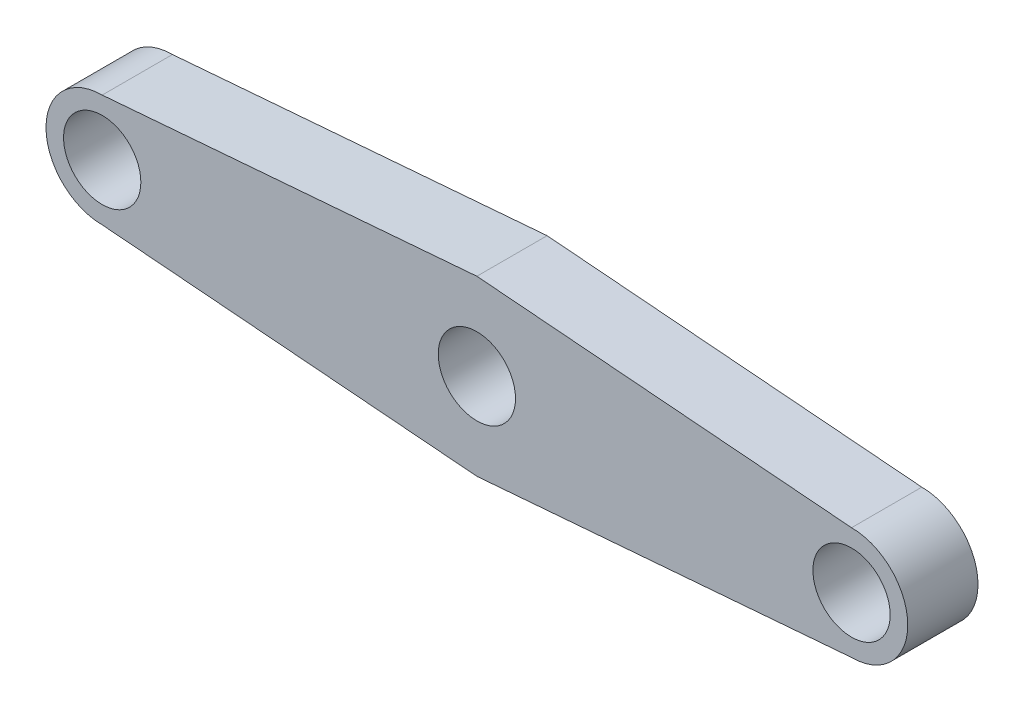
ISO-10303-21;
HEADER;
FILE_DESCRIPTION(('STEP AP214'),'2;1');
FILE_NAME('part.step','',(''),(''),'','','');
FILE_SCHEMA(('AUTOMOTIVE_DESIGN { 1 0 10303 214 1 1 1 1 }'));
ENDSEC;
DATA;
#1=APPLICATION_CONTEXT('core data for automotive mechanical design processes');
#2=APPLICATION_PROTOCOL_DEFINITION('international standard','automotive_design',2000,#1);
#3=PRODUCT_CONTEXT('',#1,'mechanical');
#4=PRODUCT('Part','Part','',(#3));
#5=PRODUCT_RELATED_PRODUCT_CATEGORY('part','',(#4));
#6=PRODUCT_DEFINITION_FORMATION('','',#4);
#7=PRODUCT_DEFINITION_CONTEXT('part definition',#1,'design');
#8=PRODUCT_DEFINITION('design','',#6,#7);
#9=PRODUCT_DEFINITION_SHAPE('','',#8);
#10=(LENGTH_UNIT() NAMED_UNIT(*) SI_UNIT(.MILLI.,.METRE.));
#11=(NAMED_UNIT(*) PLANE_ANGLE_UNIT() SI_UNIT($,.RADIAN.));
#12=(NAMED_UNIT(*) SI_UNIT($,.STERADIAN.) SOLID_ANGLE_UNIT());
#13=UNCERTAINTY_MEASURE_WITH_UNIT(LENGTH_MEASURE(1.E-05),#10,'distance_accuracy_value','');
#14=(GEOMETRIC_REPRESENTATION_CONTEXT(3) GLOBAL_UNCERTAINTY_ASSIGNED_CONTEXT((#13)) GLOBAL_UNIT_ASSIGNED_CONTEXT((#10,
#11,#12)) REPRESENTATION_CONTEXT('',''));
#15=CARTESIAN_POINT('',(0.,0.,0.));
#16=DIRECTION('',(0.,0.,1.));
#17=DIRECTION('',(1.,0.,0.));
#18=AXIS2_PLACEMENT_3D('',#15,#16,#17);
#19=CARTESIAN_POINT('',(16.,0.,3.));
#20=DIRECTION('',(0.,0.,-1.));
#21=DIRECTION('',(-1.,0.,0.));
#22=AXIS2_PLACEMENT_3D('',#19,#20,#21);
#23=CYLINDRICAL_SURFACE('',#22,1.65);
#24=CARTESIAN_POINT('',(16.,0.,3.));
#25=DIRECTION('',(0.,0.,1.));
#26=DIRECTION('',(1.,0.,0.));
#27=AXIS2_PLACEMENT_3D('',#24,#25,#26);
#28=CIRCLE('',#27,1.65);
#29=CARTESIAN_POINT('',(17.65,0.,3.));
#30=VERTEX_POINT('',#29);
#31=EDGE_CURVE('E177',#30,#30,#28,.T.);
#32=ORIENTED_EDGE('',*,*,#31,.T.);
#33=EDGE_LOOP('',(#32));
#34=FACE_BOUND('',#33,.T.);
#35=CARTESIAN_POINT('',(16.,0.,0.));
#36=DIRECTION('',(0.,0.,1.));
#37=DIRECTION('',(1.,0.,0.));
#38=AXIS2_PLACEMENT_3D('',#35,#36,#37);
#39=CIRCLE('',#38,1.65);
#40=CARTESIAN_POINT('',(17.65,0.,0.));
#41=VERTEX_POINT('',#40);
#42=EDGE_CURVE('E196',#41,#41,#39,.T.);
#43=ORIENTED_EDGE('',*,*,#42,.F.);
#44=EDGE_LOOP('',(#43));
#45=FACE_BOUND('',#44,.T.);
#46=ADVANCED_FACE('F88',(#34,#45),#23,.F.);
#47=CARTESIAN_POINT('',(0.,0.,3.));
#48=DIRECTION('',(0.,0.,-1.));
#49=DIRECTION('',(-1.,0.,0.));
#50=AXIS2_PLACEMENT_3D('',#47,#48,#49);
#51=CYLINDRICAL_SURFACE('',#50,1.65);
#52=CARTESIAN_POINT('',(0.,0.,3.));
#53=DIRECTION('',(0.,0.,1.));
#54=DIRECTION('',(1.,0.,0.));
#55=AXIS2_PLACEMENT_3D('',#52,#53,#54);
#56=CIRCLE('',#55,1.65);
#57=CARTESIAN_POINT('',(1.65,0.,3.));
#58=VERTEX_POINT('',#57);
#59=EDGE_CURVE('E174',#58,#58,#56,.T.);
#60=ORIENTED_EDGE('',*,*,#59,.T.);
#61=EDGE_LOOP('',(#60));
#62=FACE_BOUND('',#61,.T.);
#63=CARTESIAN_POINT('',(0.,0.,0.));
#64=DIRECTION('',(0.,0.,1.));
#65=DIRECTION('',(1.,0.,0.));
#66=AXIS2_PLACEMENT_3D('',#63,#64,#65);
#67=CIRCLE('',#66,1.65);
#68=CARTESIAN_POINT('',(1.65,0.,0.));
#69=VERTEX_POINT('',#68);
#70=EDGE_CURVE('E193',#69,#69,#67,.T.);
#71=ORIENTED_EDGE('',*,*,#70,.F.);
#72=EDGE_LOOP('',(#71));
#73=FACE_BOUND('',#72,.T.);
#74=ADVANCED_FACE('F230',(#62,#73),#51,.F.);
#75=CARTESIAN_POINT('',(-0.298653420776902,-3.67573440956188,3.));
#76=DIRECTION('',(0.0809831321077375,0.996715472095232,0.));
#77=DIRECTION('',(-0.996715472095232,0.0809831321077376,0.));
#78=AXIS2_PLACEMENT_3D('',#75,#76,#77);
#79=PLANE('',#78);
#80=DIRECTION('',(0.996715472095232,-0.0809831321077376,0.));
#81=VECTOR('',#80,1.);
#82=CARTESIAN_POINT('',(-0.298653420776902,-3.67573440956188,0.));
#83=LINE('',#82,#81);
#84=CARTESIAN_POINT('',(-16.,-2.4,0.));
#85=VERTEX_POINT('',#84);
#86=CARTESIAN_POINT('',(0.,-3.7,0.));
#87=VERTEX_POINT('',#86);
#88=EDGE_CURVE('E180',#85,#87,#83,.T.);
#89=ORIENTED_EDGE('',*,*,#88,.T.);
#90=DIRECTION('',(0.,0.,-1.));
#91=VECTOR('',#90,1.);
#92=CARTESIAN_POINT('',(0.,-3.7,3.));
#93=LINE('',#92,#91);
#94=CARTESIAN_POINT('',(0.,-3.7,3.));
#95=VERTEX_POINT('',#94);
#96=EDGE_CURVE('E98',#95,#87,#93,.T.);
#97=ORIENTED_EDGE('',*,*,#96,.F.);
#98=DIRECTION('',(0.996715472095232,-0.0809831321077376,0.));
#99=VECTOR('',#98,1.);
#100=CARTESIAN_POINT('',(-0.298653420776902,-3.67573440956188,3.));
#101=LINE('',#100,#99);
#102=CARTESIAN_POINT('',(-16.,-2.4,3.));
#103=VERTEX_POINT('',#102);
#104=EDGE_CURVE('E169',#103,#95,#101,.T.);
#105=ORIENTED_EDGE('',*,*,#104,.F.);
#106=DIRECTION('',(0.,0.,-1.));
#107=VECTOR('',#106,1.);
#108=CARTESIAN_POINT('',(-16.,-2.4,3.));
#109=LINE('',#108,#107);
#110=EDGE_CURVE('E12',#103,#85,#109,.T.);
#111=ORIENTED_EDGE('',*,*,#110,.T.);
#112=EDGE_LOOP('',(#89,#97,#105,#111));
#113=FACE_BOUND('',#112,.T.);
#114=ADVANCED_FACE('F216',(#113),#79,.F.);
#115=CARTESIAN_POINT('',(0.298653420776902,-3.67573440956188,3.));
#116=DIRECTION('',(0.0809831321077374,-0.996715472095232,0.));
#117=DIRECTION('',(0.996715472095232,0.0809831321077375,0.));
#118=AXIS2_PLACEMENT_3D('',#115,#116,#117);
#119=PLANE('',#118);
#120=DIRECTION('',(-0.996715472095232,-0.0809831321077375,0.));
#121=VECTOR('',#120,1.);
#122=CARTESIAN_POINT('',(0.298653420776902,-3.67573440956188,0.));
#123=LINE('',#122,#121);
#124=CARTESIAN_POINT('',(16.,-2.4,0.));
#125=VERTEX_POINT('',#124);
#126=EDGE_CURVE('E183',#125,#87,#123,.T.);
#127=ORIENTED_EDGE('',*,*,#126,.F.);
#128=DIRECTION('',(0.,0.,-1.));
#129=VECTOR('',#128,1.);
#130=CARTESIAN_POINT('',(16.,-2.4,3.));
#131=LINE('',#130,#129);
#132=CARTESIAN_POINT('',(16.,-2.4,3.));
#133=VERTEX_POINT('',#132);
#134=EDGE_CURVE('E155',#133,#125,#131,.T.);
#135=ORIENTED_EDGE('',*,*,#134,.F.);
#136=DIRECTION('',(-0.996715472095232,-0.0809831321077375,0.));
#137=VECTOR('',#136,1.);
#138=CARTESIAN_POINT('',(0.298653420776902,-3.67573440956188,3.));
#139=LINE('',#138,#137);
#140=EDGE_CURVE('E167',#133,#95,#139,.T.);
#141=ORIENTED_EDGE('',*,*,#140,.T.);
#142=ORIENTED_EDGE('',*,*,#96,.T.);
#143=EDGE_LOOP('',(#127,#135,#141,#142));
#144=FACE_BOUND('',#143,.T.);
#145=ADVANCED_FACE('F218',(#144),#119,.T.);
#146=CARTESIAN_POINT('',(16.,0.,3.));
#147=DIRECTION('',(0.,0.,-1.));
#148=DIRECTION('',(-1.,0.,0.));
#149=AXIS2_PLACEMENT_3D('',#146,#147,#148);
#150=CYLINDRICAL_SURFACE('',#149,2.40000000000001);
#151=CARTESIAN_POINT('',(16.,0.,0.));
#152=DIRECTION('',(0.,0.,1.));
#153=DIRECTION('',(1.,0.,0.));
#154=AXIS2_PLACEMENT_3D('',#151,#152,#153);
#155=CIRCLE('',#154,2.40000000000001);
#156=CARTESIAN_POINT('',(16.,2.4,0.));
#157=VERTEX_POINT('',#156);
#158=EDGE_CURVE('E152',#157,#125,#155,.F.);
#159=ORIENTED_EDGE('',*,*,#158,.F.);
#160=DIRECTION('',(0.,0.,-1.));
#161=VECTOR('',#160,1.);
#162=CARTESIAN_POINT('',(16.,2.4,3.));
#163=LINE('',#162,#161);
#164=CARTESIAN_POINT('',(16.,2.4,3.));
#165=VERTEX_POINT('',#164);
#166=EDGE_CURVE('E146',#165,#157,#163,.T.);
#167=ORIENTED_EDGE('',*,*,#166,.F.);
#168=CARTESIAN_POINT('',(16.,0.,3.));
#169=DIRECTION('',(0.,0.,1.));
#170=DIRECTION('',(1.,0.,0.));
#171=AXIS2_PLACEMENT_3D('',#168,#169,#170);
#172=CIRCLE('',#171,2.40000000000001);
#173=EDGE_CURVE('E150',#165,#133,#172,.F.);
#174=ORIENTED_EDGE('',*,*,#173,.T.);
#175=ORIENTED_EDGE('',*,*,#134,.T.);
#176=EDGE_LOOP('',(#159,#167,#174,#175));
#177=FACE_BOUND('',#176,.T.);
#178=ADVANCED_FACE('F148',(#177),#150,.T.);
#179=CARTESIAN_POINT('',(0.298653420776903,3.67573440956188,3.));
#180=DIRECTION('',(-0.0809831321077376,-0.996715472095232,0.));
#181=DIRECTION('',(0.996715472095232,-0.0809831321077376,0.));
#182=AXIS2_PLACEMENT_3D('',#179,#180,#181);
#183=PLANE('',#182);
#184=DIRECTION('',(-0.996715472095232,0.0809831321077376,0.));
#185=VECTOR('',#184,1.);
#186=CARTESIAN_POINT('',(0.298653420776903,3.67573440956188,0.));
#187=LINE('',#186,#185);
#188=CARTESIAN_POINT('',(0.,3.7,0.));
#189=VERTEX_POINT('',#188);
#190=EDGE_CURVE('E188',#157,#189,#187,.T.);
#191=ORIENTED_EDGE('',*,*,#190,.T.);
#192=DIRECTION('',(0.,0.,-1.));
#193=VECTOR('',#192,1.);
#194=CARTESIAN_POINT('',(0.,3.7,3.));
#195=LINE('',#194,#193);
#196=CARTESIAN_POINT('',(0.,3.7,3.));
#197=VERTEX_POINT('',#196);
#198=EDGE_CURVE('E127',#197,#189,#195,.T.);
#199=ORIENTED_EDGE('',*,*,#198,.F.);
#200=DIRECTION('',(-0.996715472095232,0.0809831321077376,0.));
#201=VECTOR('',#200,1.);
#202=CARTESIAN_POINT('',(0.298653420776903,3.67573440956188,3.));
#203=LINE('',#202,#201);
#204=EDGE_CURVE('E157',#165,#197,#203,.T.);
#205=ORIENTED_EDGE('',*,*,#204,.F.);
#206=ORIENTED_EDGE('',*,*,#166,.T.);
#207=EDGE_LOOP('',(#191,#199,#205,#206));
#208=FACE_BOUND('',#207,.T.);
#209=ADVANCED_FACE('F158',(#208),#183,.F.);
#210=CARTESIAN_POINT('',(-0.298653420776902,3.67573440956188,3.));
#211=DIRECTION('',(-0.0809831321077375,0.996715472095232,0.));
#212=DIRECTION('',(-0.996715472095232,-0.0809831321077376,0.));
#213=AXIS2_PLACEMENT_3D('',#210,#211,#212);
#214=PLANE('',#213);
#215=DIRECTION('',(0.996715472095232,0.0809831321077376,0.));
#216=VECTOR('',#215,1.);
#217=CARTESIAN_POINT('',(-0.298653420776902,3.67573440956188,0.));
#218=LINE('',#217,#216);
#219=CARTESIAN_POINT('',(-16.,2.4,0.));
#220=VERTEX_POINT('',#219);
#221=EDGE_CURVE('E190',#220,#189,#218,.T.);
#222=ORIENTED_EDGE('',*,*,#221,.F.);
#223=DIRECTION('',(0.,0.,-1.));
#224=VECTOR('',#223,1.);
#225=CARTESIAN_POINT('',(-16.,2.4,3.));
#226=LINE('',#225,#224);
#227=CARTESIAN_POINT('',(-16.,2.4,3.));
#228=VERTEX_POINT('',#227);
#229=EDGE_CURVE('E107',#228,#220,#226,.T.);
#230=ORIENTED_EDGE('',*,*,#229,.F.);
#231=DIRECTION('',(0.996715472095232,0.0809831321077376,0.));
#232=VECTOR('',#231,1.);
#233=CARTESIAN_POINT('',(-0.298653420776902,3.67573440956188,3.));
#234=LINE('',#233,#232);
#235=EDGE_CURVE('E161',#228,#197,#234,.T.);
#236=ORIENTED_EDGE('',*,*,#235,.T.);
#237=ORIENTED_EDGE('',*,*,#198,.T.);
#238=EDGE_LOOP('',(#222,#230,#236,#237));
#239=FACE_BOUND('',#238,.T.);
#240=ADVANCED_FACE('F219',(#239),#214,.T.);
#241=CARTESIAN_POINT('',(0.,0.,0.));
#242=DIRECTION('',(0.,0.,1.));
#243=DIRECTION('',(1.,0.,0.));
#244=AXIS2_PLACEMENT_3D('',#241,#242,#243);
#245=PLANE('',#244);
#246=ORIENTED_EDGE('',*,*,#88,.F.);
#247=CARTESIAN_POINT('',(-16.,0.,0.));
#248=DIRECTION('',(0.,0.,1.));
#249=DIRECTION('',(1.,0.,0.));
#250=AXIS2_PLACEMENT_3D('',#247,#248,#249);
#251=CIRCLE('',#250,2.4);
#252=EDGE_CURVE('E92',#220,#85,#251,.T.);
#253=ORIENTED_EDGE('',*,*,#252,.F.);
#254=ORIENTED_EDGE('',*,*,#221,.T.);
#255=ORIENTED_EDGE('',*,*,#190,.F.);
#256=ORIENTED_EDGE('',*,*,#158,.T.);
#257=ORIENTED_EDGE('',*,*,#126,.T.);
#258=EDGE_LOOP('',(#246,#253,#254,#255,#256,#257));
#259=FACE_BOUND('',#258,.T.);
#260=ORIENTED_EDGE('',*,*,#70,.T.);
#261=EDGE_LOOP('',(#260));
#262=FACE_BOUND('',#261,.T.);
#263=ORIENTED_EDGE('',*,*,#42,.T.);
#264=EDGE_LOOP('',(#263));
#265=FACE_BOUND('',#264,.T.);
#266=CARTESIAN_POINT('',(-16.,0.,0.));
#267=DIRECTION('',(0.,0.,1.));
#268=DIRECTION('',(1.,0.,0.));
#269=AXIS2_PLACEMENT_3D('',#266,#267,#268);
#270=CIRCLE('',#269,1.65);
#271=CARTESIAN_POINT('',(-14.35,0.,0.));
#272=VERTEX_POINT('',#271);
#273=EDGE_CURVE('E206',#272,#272,#270,.T.);
#274=ORIENTED_EDGE('',*,*,#273,.T.);
#275=EDGE_LOOP('',(#274));
#276=FACE_BOUND('',#275,.T.);
#277=ADVANCED_FACE('F211',(#259,#262,#265,#276),#245,.F.);
#278=CARTESIAN_POINT('',(0.,0.,3.));
#279=DIRECTION('',(0.,0.,1.));
#280=DIRECTION('',(1.,0.,0.));
#281=AXIS2_PLACEMENT_3D('',#278,#279,#280);
#282=PLANE('',#281);
#283=ORIENTED_EDGE('',*,*,#235,.F.);
#284=CARTESIAN_POINT('',(-16.,0.,3.));
#285=DIRECTION('',(0.,0.,1.));
#286=DIRECTION('',(1.,0.,0.));
#287=AXIS2_PLACEMENT_3D('',#284,#285,#286);
#288=CIRCLE('',#287,2.4);
#289=EDGE_CURVE('E184',#228,#103,#288,.T.);
#290=ORIENTED_EDGE('',*,*,#289,.T.);
#291=ORIENTED_EDGE('',*,*,#104,.T.);
#292=ORIENTED_EDGE('',*,*,#140,.F.);
#293=ORIENTED_EDGE('',*,*,#173,.F.);
#294=ORIENTED_EDGE('',*,*,#204,.T.);
#295=EDGE_LOOP('',(#283,#290,#291,#292,#293,#294));
#296=FACE_BOUND('',#295,.T.);
#297=ORIENTED_EDGE('',*,*,#59,.F.);
#298=EDGE_LOOP('',(#297));
#299=FACE_BOUND('',#298,.T.);
#300=ORIENTED_EDGE('',*,*,#31,.F.);
#301=EDGE_LOOP('',(#300));
#302=FACE_BOUND('',#301,.T.);
#303=CARTESIAN_POINT('',(-16.,0.,3.));
#304=DIRECTION('',(0.,0.,1.));
#305=DIRECTION('',(1.,0.,0.));
#306=AXIS2_PLACEMENT_3D('',#303,#304,#305);
#307=CIRCLE('',#306,1.65);
#308=CARTESIAN_POINT('',(-14.35,0.,3.));
#309=VERTEX_POINT('',#308);
#310=EDGE_CURVE('E203',#309,#309,#307,.T.);
#311=ORIENTED_EDGE('',*,*,#310,.F.);
#312=EDGE_LOOP('',(#311));
#313=FACE_BOUND('',#312,.T.);
#314=ADVANCED_FACE('F164',(#296,#299,#302,#313),#282,.T.);
#315=CARTESIAN_POINT('',(-16.,0.,3.));
#316=DIRECTION('',(0.,0.,-1.));
#317=DIRECTION('',(-1.,0.,0.));
#318=AXIS2_PLACEMENT_3D('',#315,#316,#317);
#319=CYLINDRICAL_SURFACE('',#318,1.65);
#320=ORIENTED_EDGE('',*,*,#310,.T.);
#321=EDGE_LOOP('',(#320));
#322=FACE_BOUND('',#321,.T.);
#323=ORIENTED_EDGE('',*,*,#273,.F.);
#324=EDGE_LOOP('',(#323));
#325=FACE_BOUND('',#324,.T.);
#326=ADVANCED_FACE('F240',(#322,#325),#319,.F.);
#327=CARTESIAN_POINT('',(-16.,0.,3.));
#328=DIRECTION('',(0.,0.,-1.));
#329=DIRECTION('',(-1.,0.,0.));
#330=AXIS2_PLACEMENT_3D('',#327,#328,#329);
#331=CYLINDRICAL_SURFACE('',#330,2.4);
#332=ORIENTED_EDGE('',*,*,#252,.T.);
#333=ORIENTED_EDGE('',*,*,#110,.F.);
#334=ORIENTED_EDGE('',*,*,#289,.F.);
#335=ORIENTED_EDGE('',*,*,#229,.T.);
#336=EDGE_LOOP('',(#332,#333,#334,#335));
#337=FACE_BOUND('',#336,.T.);
#338=ADVANCED_FACE('F90',(#337),#331,.T.);
#339=CLOSED_SHELL('',(#46,#74,#114,#145,#178,#209,#240,#277,#314,#326,#338));
#340=MANIFOLD_SOLID_BREP('B2',#339);
#341=ADVANCED_BREP_SHAPE_REPRESENTATION('',(#18,#340),#14);
#342=SHAPE_DEFINITION_REPRESENTATION(#9,#341);
ENDSEC;
END-ISO-10303-21;
